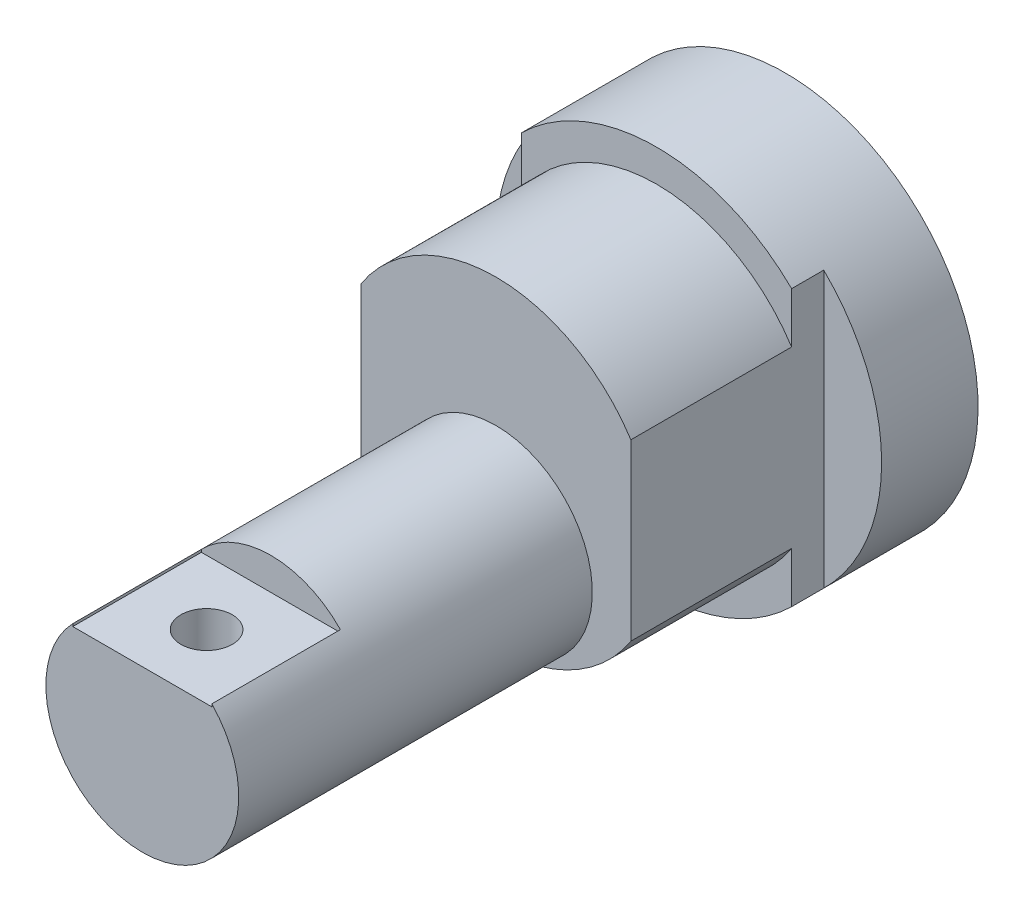
ISO-10303-21;
HEADER;
FILE_DESCRIPTION(('STEP AP214'),'2;1');
FILE_NAME('part.step','',(''),(''),'','','');
FILE_SCHEMA(('AUTOMOTIVE_DESIGN { 1 0 10303 214 1 1 1 1 }'));
ENDSEC;
DATA;
#1=APPLICATION_CONTEXT('core data for automotive mechanical design processes');
#2=APPLICATION_PROTOCOL_DEFINITION('international standard','automotive_design',2000,#1);
#3=PRODUCT_CONTEXT('',#1,'mechanical');
#4=PRODUCT('Part','Part','',(#3));
#5=PRODUCT_RELATED_PRODUCT_CATEGORY('part','',(#4));
#6=PRODUCT_DEFINITION_FORMATION('','',#4);
#7=PRODUCT_DEFINITION_CONTEXT('part definition',#1,'design');
#8=PRODUCT_DEFINITION('design','',#6,#7);
#9=PRODUCT_DEFINITION_SHAPE('','',#8);
#10=(LENGTH_UNIT() NAMED_UNIT(*) SI_UNIT(.MILLI.,.METRE.));
#11=(NAMED_UNIT(*) PLANE_ANGLE_UNIT() SI_UNIT($,.RADIAN.));
#12=(NAMED_UNIT(*) SI_UNIT($,.STERADIAN.) SOLID_ANGLE_UNIT());
#13=UNCERTAINTY_MEASURE_WITH_UNIT(LENGTH_MEASURE(1.E-05),#10,'distance_accuracy_value','');
#14=(GEOMETRIC_REPRESENTATION_CONTEXT(3) GLOBAL_UNCERTAINTY_ASSIGNED_CONTEXT((#13)) GLOBAL_UNIT_ASSIGNED_CONTEXT((#10,
#11,#12)) REPRESENTATION_CONTEXT('',''));
#15=CARTESIAN_POINT('',(0.,0.,0.));
#16=DIRECTION('',(0.,0.,1.));
#17=DIRECTION('',(1.,0.,0.));
#18=AXIS2_PLACEMENT_3D('',#15,#16,#17);
#19=CARTESIAN_POINT('',(0.,10.,-55.));
#20=DIRECTION('',(0.,0.,-1.));
#21=DIRECTION('',(-1.,0.,0.));
#22=AXIS2_PLACEMENT_3D('',#19,#20,#21);
#23=PLANE('',#22);
#24=DIRECTION('',(0.,-1.,0.));
#25=VECTOR('',#24,1.);
#26=CARTESIAN_POINT('',(-21.,25.,-55.));
#27=LINE('',#26,#25);
#28=CARTESIAN_POINT('',(-21.,23.5646599662505,-55.));
#29=VERTEX_POINT('',#28);
#30=CARTESIAN_POINT('',(-21.,-3.56465996625054,-55.));
#31=VERTEX_POINT('',#30);
#32=EDGE_CURVE('E142',#29,#31,#27,.T.);
#33=ORIENTED_EDGE('',*,*,#32,.T.);
#34=CARTESIAN_POINT('',(0.,10.,-55.));
#35=DIRECTION('',(0.,0.,-1.));
#36=DIRECTION('',(-1.,0.,0.));
#37=AXIS2_PLACEMENT_3D('',#34,#35,#36);
#38=CIRCLE('',#37,25.);
#39=CARTESIAN_POINT('',(0.,-15.,-55.));
#40=VERTEX_POINT('',#39);
#41=EDGE_CURVE('E166',#40,#31,#38,.T.);
#42=ORIENTED_EDGE('',*,*,#41,.F.);
#43=CARTESIAN_POINT('',(0.,0.,-55.));
#44=DIRECTION('',(0.,0.,1.));
#45=DIRECTION('',(1.,0.,0.));
#46=AXIS2_PLACEMENT_3D('',#43,#44,#45);
#47=CIRCLE('',#46,15.);
#48=EDGE_CURVE('E175',#40,#40,#47,.T.);
#49=ORIENTED_EDGE('',*,*,#48,.F.);
#50=CARTESIAN_POINT('',(21.,-3.56465996625054,-55.));
#51=VERTEX_POINT('',#50);
#52=EDGE_CURVE('E70',#51,#40,#38,.T.);
#53=ORIENTED_EDGE('',*,*,#52,.F.);
#54=DIRECTION('',(0.,-1.,0.));
#55=VECTOR('',#54,1.);
#56=CARTESIAN_POINT('',(21.,25.,-55.));
#57=LINE('',#56,#55);
#58=CARTESIAN_POINT('',(21.,23.5646599662505,-55.));
#59=VERTEX_POINT('',#58);
#60=EDGE_CURVE('E164',#59,#51,#57,.T.);
#61=ORIENTED_EDGE('',*,*,#60,.F.);
#62=EDGE_CURVE('E158',#29,#59,#38,.T.);
#63=ORIENTED_EDGE('',*,*,#62,.F.);
#64=EDGE_LOOP('',(#33,#42,#49,#53,#61,#63));
#65=FACE_BOUND('',#64,.T.);
#66=ADVANCED_FACE('F45',(#65),#23,.F.);
#67=CARTESIAN_POINT('',(0.,10.,-80.));
#68=DIRECTION('',(0.,0.,1.));
#69=DIRECTION('',(1.,0.,0.));
#70=AXIS2_PLACEMENT_3D('',#67,#68,#69);
#71=CYLINDRICAL_SURFACE('',#70,25.);
#72=DIRECTION('',(0.,0.,1.));
#73=VECTOR('',#72,1.);
#74=CARTESIAN_POINT('',(-21.,-3.56465996625054,-80.));
#75=LINE('',#74,#73);
#76=CARTESIAN_POINT('',(-21.,-3.56465996625054,-80.));
#77=VERTEX_POINT('',#76);
#78=EDGE_CURVE('E149',#77,#31,#75,.T.);
#79=ORIENTED_EDGE('',*,*,#78,.F.);
#80=CARTESIAN_POINT('',(0.,10.,-80.));
#81=DIRECTION('',(0.,0.,-1.));
#82=DIRECTION('',(-1.,0.,0.));
#83=AXIS2_PLACEMENT_3D('',#80,#81,#82);
#84=CIRCLE('',#83,25.);
#85=CARTESIAN_POINT('',(21.,-3.56465996625054,-80.));
#86=VERTEX_POINT('',#85);
#87=EDGE_CURVE('E173',#86,#77,#84,.T.);
#88=ORIENTED_EDGE('',*,*,#87,.F.);
#89=DIRECTION('',(0.,0.,1.));
#90=VECTOR('',#89,1.);
#91=CARTESIAN_POINT('',(21.,-3.56465996625054,-80.));
#92=LINE('',#91,#90);
#93=EDGE_CURVE('E233',#51,#86,#92,.F.);
#94=ORIENTED_EDGE('',*,*,#93,.F.);
#95=ORIENTED_EDGE('',*,*,#52,.T.);
#96=ORIENTED_EDGE('',*,*,#41,.T.);
#97=EDGE_LOOP('',(#79,#88,#94,#95,#96));
#98=FACE_BOUND('',#97,.T.);
#99=ADVANCED_FACE('F212',(#98),#71,.T.);
#100=DIRECTION('',(0.,0.,1.));
#101=VECTOR('',#100,1.);
#102=CARTESIAN_POINT('',(-21.,23.5646599662505,-80.));
#103=LINE('',#102,#101);
#104=CARTESIAN_POINT('',(-21.,23.5646599662505,-80.));
#105=VERTEX_POINT('',#104);
#106=EDGE_CURVE('E146',#29,#105,#103,.F.);
#107=ORIENTED_EDGE('',*,*,#106,.F.);
#108=ORIENTED_EDGE('',*,*,#62,.T.);
#109=DIRECTION('',(0.,0.,1.));
#110=VECTOR('',#109,1.);
#111=CARTESIAN_POINT('',(21.,23.5646599662505,-80.));
#112=LINE('',#111,#110);
#113=CARTESIAN_POINT('',(21.,23.5646599662505,-80.));
#114=VERTEX_POINT('',#113);
#115=EDGE_CURVE('E227',#114,#59,#112,.T.);
#116=ORIENTED_EDGE('',*,*,#115,.F.);
#117=EDGE_CURVE('E160',#105,#114,#84,.T.);
#118=ORIENTED_EDGE('',*,*,#117,.F.);
#119=EDGE_LOOP('',(#107,#108,#116,#118));
#120=FACE_BOUND('',#119,.T.);
#121=ADVANCED_FACE('F156',(#120),#71,.T.);
#122=CARTESIAN_POINT('',(0.,10.,-100.));
#123=DIRECTION('',(0.,0.,1.));
#124=DIRECTION('',(1.,0.,0.));
#125=AXIS2_PLACEMENT_3D('',#122,#123,#124);
#126=CYLINDRICAL_SURFACE('',#125,30.);
#127=CARTESIAN_POINT('',(0.,10.,-100.));
#128=DIRECTION('',(0.,0.,-1.));
#129=DIRECTION('',(-1.,0.,0.));
#130=AXIS2_PLACEMENT_3D('',#127,#128,#129);
#131=CIRCLE('',#130,30.);
#132=CARTESIAN_POINT('',(-30.,10.,-100.));
#133=VERTEX_POINT('',#132);
#134=EDGE_CURVE('E170',#133,#133,#131,.T.);
#135=ORIENTED_EDGE('',*,*,#134,.F.);
#136=EDGE_LOOP('',(#135));
#137=FACE_BOUND('',#136,.T.);
#138=DIRECTION('',(0.,0.,1.));
#139=VECTOR('',#138,1.);
#140=CARTESIAN_POINT('',(-21.,-11.4242852856286,-100.));
#141=LINE('',#140,#139);
#142=CARTESIAN_POINT('',(-21.,-11.4242852856286,-85.));
#143=VERTEX_POINT('',#142);
#144=CARTESIAN_POINT('',(-21.,-11.4242852856286,-80.));
#145=VERTEX_POINT('',#144);
#146=EDGE_CURVE('E206',#143,#145,#141,.T.);
#147=ORIENTED_EDGE('',*,*,#146,.F.);
#148=CARTESIAN_POINT('',(0.,10.,-85.));
#149=DIRECTION('',(0.,0.,-1.));
#150=DIRECTION('',(-1.,0.,0.));
#151=AXIS2_PLACEMENT_3D('',#148,#149,#150);
#152=CIRCLE('',#151,30.);
#153=CARTESIAN_POINT('',(-21.,31.4242852856285,-85.));
#154=VERTEX_POINT('',#153);
#155=EDGE_CURVE('E11',#143,#154,#152,.T.);
#156=ORIENTED_EDGE('',*,*,#155,.T.);
#157=DIRECTION('',(0.,0.,1.));
#158=VECTOR('',#157,1.);
#159=CARTESIAN_POINT('',(-21.,31.4242852856285,-100.));
#160=LINE('',#159,#158);
#161=CARTESIAN_POINT('',(-21.,31.4242852856285,-80.));
#162=VERTEX_POINT('',#161);
#163=EDGE_CURVE('E214',#162,#154,#160,.F.);
#164=ORIENTED_EDGE('',*,*,#163,.F.);
#165=CARTESIAN_POINT('',(0.,10.,-80.));
#166=DIRECTION('',(0.,0.,-1.));
#167=DIRECTION('',(-1.,0.,0.));
#168=AXIS2_PLACEMENT_3D('',#165,#166,#167);
#169=CIRCLE('',#168,30.);
#170=CARTESIAN_POINT('',(21.,31.4242852856285,-80.));
#171=VERTEX_POINT('',#170);
#172=EDGE_CURVE('E328',#162,#171,#169,.T.);
#173=ORIENTED_EDGE('',*,*,#172,.T.);
#174=DIRECTION('',(0.,0.,1.));
#175=VECTOR('',#174,1.);
#176=CARTESIAN_POINT('',(21.,31.4242852856285,-100.));
#177=LINE('',#176,#175);
#178=CARTESIAN_POINT('',(21.,31.4242852856285,-85.));
#179=VERTEX_POINT('',#178);
#180=EDGE_CURVE('E230',#179,#171,#177,.T.);
#181=ORIENTED_EDGE('',*,*,#180,.F.);
#182=CARTESIAN_POINT('',(0.,10.,-85.));
#183=DIRECTION('',(0.,0.,1.));
#184=DIRECTION('',(1.,0.,0.));
#185=AXIS2_PLACEMENT_3D('',#182,#183,#184);
#186=CIRCLE('',#185,30.);
#187=CARTESIAN_POINT('',(21.,-11.4242852856286,-85.));
#188=VERTEX_POINT('',#187);
#189=EDGE_CURVE('E198',#188,#179,#186,.T.);
#190=ORIENTED_EDGE('',*,*,#189,.F.);
#191=DIRECTION('',(0.,0.,1.));
#192=VECTOR('',#191,1.);
#193=CARTESIAN_POINT('',(21.,-11.4242852856286,-100.));
#194=LINE('',#193,#192);
#195=CARTESIAN_POINT('',(21.,-11.4242852856286,-80.));
#196=VERTEX_POINT('',#195);
#197=EDGE_CURVE('E232',#196,#188,#194,.F.);
#198=ORIENTED_EDGE('',*,*,#197,.F.);
#199=EDGE_CURVE('E331',#196,#145,#169,.T.);
#200=ORIENTED_EDGE('',*,*,#199,.T.);
#201=EDGE_LOOP('',(#147,#156,#164,#173,#181,#190,#198,#200));
#202=FACE_BOUND('',#201,.T.);
#203=ADVANCED_FACE('F289',(#137,#202),#126,.T.);
#204=CARTESIAN_POINT('',(0.,10.,-80.));
#205=DIRECTION('',(0.,0.,-1.));
#206=DIRECTION('',(-1.,0.,0.));
#207=AXIS2_PLACEMENT_3D('',#204,#205,#206);
#208=PLANE('',#207);
#209=DIRECTION('',(0.,1.,0.));
#210=VECTOR('',#209,1.);
#211=CARTESIAN_POINT('',(-21.,10.,-80.));
#212=LINE('',#211,#210);
#213=EDGE_CURVE('E55',#145,#77,#212,.T.);
#214=ORIENTED_EDGE('',*,*,#213,.F.);
#215=ORIENTED_EDGE('',*,*,#199,.F.);
#216=DIRECTION('',(0.,-1.,0.));
#217=VECTOR('',#216,1.);
#218=CARTESIAN_POINT('',(21.,10.,-80.));
#219=LINE('',#218,#217);
#220=EDGE_CURVE('E193',#86,#196,#219,.T.);
#221=ORIENTED_EDGE('',*,*,#220,.F.);
#222=ORIENTED_EDGE('',*,*,#87,.T.);
#223=EDGE_LOOP('',(#214,#215,#221,#222));
#224=FACE_BOUND('',#223,.T.);
#225=ADVANCED_FACE('F217',(#224),#208,.F.);
#226=EDGE_CURVE('E200',#105,#162,#212,.T.);
#227=ORIENTED_EDGE('',*,*,#226,.F.);
#228=ORIENTED_EDGE('',*,*,#117,.T.);
#229=EDGE_CURVE('E194',#171,#114,#219,.T.);
#230=ORIENTED_EDGE('',*,*,#229,.F.);
#231=ORIENTED_EDGE('',*,*,#172,.F.);
#232=EDGE_LOOP('',(#227,#228,#230,#231));
#233=FACE_BOUND('',#232,.T.);
#234=ADVANCED_FACE('F222',(#233),#208,.F.);
#235=CARTESIAN_POINT('',(0.,0.,-55.));
#236=DIRECTION('',(0.,0.,1.));
#237=DIRECTION('',(1.,0.,0.));
#238=AXIS2_PLACEMENT_3D('',#235,#236,#237);
#239=CYLINDRICAL_SURFACE('',#238,15.);
#240=CARTESIAN_POINT('',(0.,-15.,-6.));
#241=CARTESIAN_POINT('',(-0.220509111665708,-14.9999966762032,-6.0000052338697));
#242=CARTESIAN_POINT('',(-0.44107432044368,-14.995089723243,-6.01829522837934));
#243=CARTESIAN_POINT('',(-0.875850902708927,-14.9759914724332,-6.09084246147739));
#244=CARTESIAN_POINT('',(-1.09005916663817,-14.9617957066517,-6.14511700885223));
#245=CARTESIAN_POINT('',(-1.50578317809062,-14.9256866650558,-6.28774333372807));
#246=CARTESIAN_POINT('',(-1.70731490203057,-14.9037833426075,-6.37605117533204));
#247=CARTESIAN_POINT('',(-2.09270737278532,-14.8545739830336,-6.58407448533323));
#248=CARTESIAN_POINT('',(-2.27656694089925,-14.8272675859036,-6.70379204671858));
#249=CARTESIAN_POINT('',(-2.62565900748003,-14.7694922980399,-6.97416703282674));
#250=CARTESIAN_POINT('',(-2.79042337972557,-14.7389693535736,-7.12541733601653));
#251=CARTESIAN_POINT('',(-3.09257427321275,-14.6785481935918,-7.45329696612671));
#252=CARTESIAN_POINT('',(-3.22995726991329,-14.6486500589449,-7.62992955523505));
#253=CARTESIAN_POINT('',(-3.4757281848683,-14.5923107492874,-8.0072964696509));
#254=CARTESIAN_POINT('',(-3.58357755472975,-14.5659377712648,-8.20839265652346));
#255=CARTESIAN_POINT('',(-3.76375096153988,-14.5204295463637,-8.62668022218485));
#256=CARTESIAN_POINT('',(-3.83608154902738,-14.5012929650653,-8.84386862466287));
#257=CARTESIAN_POINT('',(-3.94153840453008,-14.472982316048,-9.28299107565003));
#258=CARTESIAN_POINT('',(-3.97551340489383,-14.4635929562298,-9.50470707986147));
#259=CARTESIAN_POINT('',(-4.00594069411639,-14.4551966183274,-9.95087536661308));
#260=CARTESIAN_POINT('',(-4.00239999411507,-14.4561877002889,-10.1753271300481));
#261=CARTESIAN_POINT('',(-3.95857020005398,-14.4682475760406,-10.6139708307481));
#262=CARTESIAN_POINT('',(-3.91930812129529,-14.4790347102306,-10.828274364077));
#263=CARTESIAN_POINT('',(-3.80679497444366,-14.5090202616138,-11.2471366689125));
#264=CARTESIAN_POINT('',(-3.7335411898599,-14.5282193510523,-11.4516946601507));
#265=CARTESIAN_POINT('',(-3.55428713930512,-14.5731132349677,-11.8479362876172));
#266=CARTESIAN_POINT('',(-3.44792682275569,-14.5988788563741,-12.0394486785725));
#267=CARTESIAN_POINT('',(-3.20573007647555,-14.6539645928489,-12.402268317703));
#268=CARTESIAN_POINT('',(-3.06988784448503,-14.6832854071037,-12.5735715783129));
#269=CARTESIAN_POINT('',(-2.76733214526838,-14.7433502125973,-12.8969779949096));
#270=CARTESIAN_POINT('',(-2.59975625456598,-14.7741094297766,-13.0482726366299));
#271=CARTESIAN_POINT('',(-2.24123533641275,-14.8327276255263,-13.3207775607006));
#272=CARTESIAN_POINT('',(-2.05028938841018,-14.8605864897711,-13.4419866574049));
#273=CARTESIAN_POINT('',(-1.6491965109949,-14.9104364079659,-13.6512358056493));
#274=CARTESIAN_POINT('',(-1.43896980510358,-14.9324014566712,-13.7391295408972));
#275=CARTESIAN_POINT('',(-1.00600458878079,-14.96780088802,-13.8780943776267));
#276=CARTESIAN_POINT('',(-0.783268823856647,-14.981237134675,-13.9291735254479));
#277=CARTESIAN_POINT('',(-0.33850816629103,-14.9977831711677,-13.9917897538357));
#278=CARTESIAN_POINT('',(-0.116648475282761,-15.0011799494192,-14.0044260797017));
#279=CARTESIAN_POINT('',(0.326020091802397,-14.9980894338339,-13.9928336715061));
#280=CARTESIAN_POINT('',(0.546829074124226,-14.9916031616071,-13.9686087477885));
#281=CARTESIAN_POINT('',(0.977204899803558,-14.9696607099204,-13.88488310508));
#282=CARTESIAN_POINT('',(1.18689970405556,-14.9543605309265,-13.8259955076045));
#283=CARTESIAN_POINT('',(1.59341394235213,-14.9165258978828,-13.6753281109841));
#284=CARTESIAN_POINT('',(1.79023197843205,-14.8939906599234,-13.5835447474989));
#285=CARTESIAN_POINT('',(2.1696769493359,-14.8435132111904,-13.3676522256389));
#286=CARTESIAN_POINT('',(2.35195037692236,-14.8154737320985,-13.2429450664045));
#287=CARTESIAN_POINT('',(2.69336927079429,-14.7572290473119,-12.965496739684));
#288=CARTESIAN_POINT('',(2.85251015759837,-14.7270234145527,-12.8127500347979));
#289=CARTESIAN_POINT('',(3.14777848957546,-14.6667949173317,-12.4784288450108));
#290=CARTESIAN_POINT('',(3.28313038499627,-14.6368012285772,-12.2961628772095));
#291=CARTESIAN_POINT('',(3.52134382370242,-14.5813289436636,-11.9108706078009));
#292=CARTESIAN_POINT('',(3.62420672244342,-14.5558501591602,-11.707845172756));
#293=CARTESIAN_POINT('',(3.79374823172205,-14.5125853674305,-11.2878093858471));
#294=CARTESIAN_POINT('',(3.8606362450784,-14.4947549662348,-11.0708883763624));
#295=CARTESIAN_POINT('',(3.95682410237657,-14.4687965026614,-10.6283213606529));
#296=CARTESIAN_POINT('',(3.98613355205236,-14.4606659608681,-10.4026775993132));
#297=CARTESIAN_POINT('',(4.00577979307212,-14.4552348910192,-9.9570104242114));
#298=CARTESIAN_POINT('',(3.99736311235129,-14.4575879532022,-9.73704535942668));
#299=CARTESIAN_POINT('',(3.94468751999858,-14.4720479199639,-9.3017929719295));
#300=CARTESIAN_POINT('',(3.9004295306998,-14.4841545735456,-9.08650552899045));
#301=CARTESIAN_POINT('',(3.77805031399794,-14.5165514219021,-8.66828849575977));
#302=CARTESIAN_POINT('',(3.70019322151266,-14.5367777005106,-8.46527631454085));
#303=CARTESIAN_POINT('',(3.51303109124666,-14.5831363626058,-8.0750423389265));
#304=CARTESIAN_POINT('',(3.40372112049204,-14.6092696723953,-7.8878230273976));
#305=CARTESIAN_POINT('',(3.15297818537663,-14.6654584288421,-7.52853928100823));
#306=CARTESIAN_POINT('',(3.01069459535827,-14.6956066620426,-7.35708293004796));
#307=CARTESIAN_POINT('',(2.69966107022192,-14.7559100756513,-7.04007509666496));
#308=CARTESIAN_POINT('',(2.53090470871747,-14.7860652559664,-6.89452992266221));
#309=CARTESIAN_POINT('',(2.16735996217739,-14.8437562480818,-6.63041552470639));
#310=CARTESIAN_POINT('',(1.97209192350356,-14.8712222262917,-6.51248997870137));
#311=CARTESIAN_POINT('',(1.56377728083377,-14.9196762020573,-6.31132516814125));
#312=CARTESIAN_POINT('',(1.35074218939259,-14.9406683536717,-6.22806364867279));
#313=CARTESIAN_POINT('',(0.948749409761982,-14.9710950502695,-6.10944942916897));
#314=CARTESIAN_POINT('',(0.761524033130071,-14.9818554118521,-6.06850123281501));
#315=CARTESIAN_POINT('',(0.382879590634151,-14.9963089807291,-6.01377558766588));
#316=CARTESIAN_POINT('',(0.19146094080972,-15.0000028859454,-5.99999545559995));
#317=CARTESIAN_POINT('',(0.,-15.,-6.));
#318=B_SPLINE_CURVE_WITH_KNOTS('',3,(#240,#241,#242,#243,#244,#245,#246,#247,#248,#249,#250,
#251,#252,#253,#254,#255,#256,#257,#258,#259,#260,#261,#262,#263,#264,#265,#266,#267,#268,#269,
#270,#271,#272,#273,#274,#275,#276,#277,#278,#279,#280,#281,#282,#283,#284,#285,#286,#287,#288,
#289,#290,#291,#292,#293,#294,#295,#296,#297,#298,#299,#300,#301,#302,#303,#304,#305,#306,#307,
#308,#309,#310,#311,#312,#313,#314,#315,#316,#317),.UNSPECIFIED.,.T.,.F.,(4,2,2,2,2,2,2,2,2,2,2,
2,2,2,2,2,2,2,2,2,2,2,2,2,2,2,2,2,2,2,2,2,2,2,2,2,2,2,4),(0.,0.660825197899137,1.3219684875229,
1.98226110594386,2.6425977341735,3.31669795909934,3.99088489850298,4.67665165046458,
5.36229188259399,6.03244316500935,6.70246920808639,7.35382004091993,8.00522293625879,
8.66397346692996,9.32285376235259,10.0032251962464,10.6836234387519,11.3669761920608,
12.0501795438028,12.7136543504909,13.377060578507,14.0290707128423,14.6811515155123,
15.346005720091,16.0109913651777,16.6947299276558,17.3784399604821,18.0581259539877,
18.7376381732797,19.394866848109,20.0520786104837,20.7042153090379,21.3564543425319,
22.0278867914997,22.6994824867208,23.3854450456898,24.0709665229755,24.6447963799386,
25.2185695593995),.UNSPECIFIED.);
#319=CARTESIAN_POINT('',(0.,-15.,-6.));
#320=VERTEX_POINT('',#319);
#321=EDGE_CURVE('E248',#320,#320,#318,.T.);
#322=ORIENTED_EDGE('',*,*,#321,.F.);
#323=EDGE_LOOP('',(#322));
#324=FACE_BOUND('',#323,.T.);
#325=ORIENTED_EDGE('',*,*,#48,.T.);
#326=EDGE_LOOP('',(#325));
#327=FACE_BOUND('',#326,.T.);
#328=CARTESIAN_POINT('',(0.,0.,0.));
#329=DIRECTION('',(0.,0.,1.));
#330=DIRECTION('',(1.,0.,0.));
#331=AXIS2_PLACEMENT_3D('',#328,#329,#330);
#332=CIRCLE('',#331,15.);
#333=CARTESIAN_POINT('',(-10.8113136380608,10.3978602327345,0.));
#334=VERTEX_POINT('',#333);
#335=CARTESIAN_POINT('',(10.8113136380608,10.3978602327345,0.));
#336=VERTEX_POINT('',#335);
#337=EDGE_CURVE('E180',#334,#336,#332,.T.);
#338=ORIENTED_EDGE('',*,*,#337,.F.);
#339=DIRECTION('',(0.,0.,1.));
#340=VECTOR('',#339,1.);
#341=CARTESIAN_POINT('',(-10.8113136380608,10.3978602327345,-55.));
#342=LINE('',#341,#340);
#343=CARTESIAN_POINT('',(-10.8113136380608,10.3978602327345,-20.));
#344=VERTEX_POINT('',#343);
#345=EDGE_CURVE('E324',#334,#344,#342,.F.);
#346=ORIENTED_EDGE('',*,*,#345,.T.);
#347=CARTESIAN_POINT('',(0.,0.,-20.));
#348=DIRECTION('',(0.,0.,-1.));
#349=DIRECTION('',(-1.,0.,0.));
#350=AXIS2_PLACEMENT_3D('',#347,#348,#349);
#351=CIRCLE('',#350,15.);
#352=CARTESIAN_POINT('',(10.8113136380607,10.3978602327345,-20.));
#353=VERTEX_POINT('',#352);
#354=EDGE_CURVE('E190',#353,#344,#351,.F.);
#355=ORIENTED_EDGE('',*,*,#354,.F.);
#356=DIRECTION('',(0.,0.,1.));
#357=VECTOR('',#356,1.);
#358=CARTESIAN_POINT('',(10.8113136380607,10.3978602327345,-55.));
#359=LINE('',#358,#357);
#360=EDGE_CURVE('E319',#336,#353,#359,.F.);
#361=ORIENTED_EDGE('',*,*,#360,.F.);
#362=EDGE_LOOP('',(#338,#346,#355,#361));
#363=FACE_BOUND('',#362,.T.);
#364=ADVANCED_FACE('F47',(#324,#327,#363),#239,.T.);
#365=CARTESIAN_POINT('',(0.,0.,0.));
#366=DIRECTION('',(0.,0.,1.));
#367=DIRECTION('',(1.,0.,0.));
#368=AXIS2_PLACEMENT_3D('',#365,#366,#367);
#369=PLANE('',#368);
#370=DIRECTION('',(1.,0.,0.));
#371=VECTOR('',#370,1.);
#372=CARTESIAN_POINT('',(-10.8113136380608,10.,0.));
#373=LINE('',#372,#371);
#374=CARTESIAN_POINT('',(-10.8113136380608,10.,0.));
#375=VERTEX_POINT('',#374);
#376=CARTESIAN_POINT('',(10.8113136380608,10.,0.));
#377=VERTEX_POINT('',#376);
#378=EDGE_CURVE('E304',#375,#377,#373,.T.);
#379=ORIENTED_EDGE('',*,*,#378,.F.);
#380=DIRECTION('',(0.,1.,0.));
#381=VECTOR('',#380,1.);
#382=CARTESIAN_POINT('',(-10.8113136380608,0.,0.));
#383=LINE('',#382,#381);
#384=EDGE_CURVE('E186',#375,#334,#383,.T.);
#385=ORIENTED_EDGE('',*,*,#384,.T.);
#386=ORIENTED_EDGE('',*,*,#337,.T.);
#387=DIRECTION('',(0.,1.,0.));
#388=VECTOR('',#387,1.);
#389=CARTESIAN_POINT('',(10.8113136380608,0.,0.));
#390=LINE('',#389,#388);
#391=EDGE_CURVE('E179',#377,#336,#390,.T.);
#392=ORIENTED_EDGE('',*,*,#391,.F.);
#393=EDGE_LOOP('',(#379,#385,#386,#392));
#394=FACE_BOUND('',#393,.T.);
#395=ADVANCED_FACE('F285',(#394),#369,.T.);
#396=CARTESIAN_POINT('',(0.,10.,-100.));
#397=DIRECTION('',(0.,0.,-1.));
#398=DIRECTION('',(-1.,0.,0.));
#399=AXIS2_PLACEMENT_3D('',#396,#397,#398);
#400=PLANE('',#399);
#401=ORIENTED_EDGE('',*,*,#134,.T.);
#402=EDGE_LOOP('',(#401));
#403=FACE_BOUND('',#402,.T.);
#404=ADVANCED_FACE('F281',(#403),#400,.T.);
#405=CARTESIAN_POINT('',(-10.8113136380608,30.,-20.));
#406=DIRECTION('',(0.,0.,-1.));
#407=DIRECTION('',(-1.,0.,0.));
#408=AXIS2_PLACEMENT_3D('',#405,#406,#407);
#409=PLANE('',#408);
#410=ORIENTED_EDGE('',*,*,#354,.T.);
#411=DIRECTION('',(0.,-1.,0.));
#412=VECTOR('',#411,1.);
#413=CARTESIAN_POINT('',(-10.8113136380608,30.,-20.));
#414=LINE('',#413,#412);
#415=CARTESIAN_POINT('',(-10.8113136380608,10.,-20.));
#416=VERTEX_POINT('',#415);
#417=EDGE_CURVE('E316',#344,#416,#414,.T.);
#418=ORIENTED_EDGE('',*,*,#417,.T.);
#419=DIRECTION('',(1.,0.,0.));
#420=VECTOR('',#419,1.);
#421=CARTESIAN_POINT('',(-10.8113136380608,10.,-20.));
#422=LINE('',#421,#420);
#423=CARTESIAN_POINT('',(10.8113136380607,10.,-20.));
#424=VERTEX_POINT('',#423);
#425=EDGE_CURVE('E256',#416,#424,#422,.T.);
#426=ORIENTED_EDGE('',*,*,#425,.T.);
#427=DIRECTION('',(0.,-1.,0.));
#428=VECTOR('',#427,1.);
#429=CARTESIAN_POINT('',(10.8113136380607,30.,-20.));
#430=LINE('',#429,#428);
#431=EDGE_CURVE('E313',#353,#424,#430,.T.);
#432=ORIENTED_EDGE('',*,*,#431,.F.);
#433=EDGE_LOOP('',(#410,#418,#426,#432));
#434=FACE_BOUND('',#433,.T.);
#435=ADVANCED_FACE('F274',(#434),#409,.F.);
#436=CARTESIAN_POINT('',(-10.8113136380608,30.,-20.));
#437=DIRECTION('',(1.,0.,0.));
#438=DIRECTION('',(0.,0.,-1.));
#439=AXIS2_PLACEMENT_3D('',#436,#437,#438);
#440=PLANE('',#439);
#441=ORIENTED_EDGE('',*,*,#384,.F.);
#442=DIRECTION('',(0.,0.,1.));
#443=VECTOR('',#442,1.);
#444=CARTESIAN_POINT('',(-10.8113136380608,10.,-20.));
#445=LINE('',#444,#443);
#446=EDGE_CURVE('E62',#416,#375,#445,.T.);
#447=ORIENTED_EDGE('',*,*,#446,.F.);
#448=ORIENTED_EDGE('',*,*,#417,.F.);
#449=ORIENTED_EDGE('',*,*,#345,.F.);
#450=EDGE_LOOP('',(#441,#447,#448,#449));
#451=FACE_BOUND('',#450,.T.);
#452=ADVANCED_FACE('F271',(#451),#440,.T.);
#453=CARTESIAN_POINT('',(10.8113136380607,30.,-20.));
#454=DIRECTION('',(1.,0.,0.));
#455=DIRECTION('',(0.,0.,-1.));
#456=AXIS2_PLACEMENT_3D('',#453,#454,#455);
#457=PLANE('',#456);
#458=ORIENTED_EDGE('',*,*,#360,.T.);
#459=ORIENTED_EDGE('',*,*,#431,.T.);
#460=DIRECTION('',(0.,0.,1.));
#461=VECTOR('',#460,1.);
#462=CARTESIAN_POINT('',(10.8113136380607,10.,-20.));
#463=LINE('',#462,#461);
#464=EDGE_CURVE('E309',#424,#377,#463,.T.);
#465=ORIENTED_EDGE('',*,*,#464,.T.);
#466=ORIENTED_EDGE('',*,*,#391,.T.);
#467=EDGE_LOOP('',(#458,#459,#465,#466));
#468=FACE_BOUND('',#467,.T.);
#469=ADVANCED_FACE('F269',(#468),#457,.F.);
#470=CARTESIAN_POINT('',(0.,10.,0.));
#471=DIRECTION('',(0.,-1.,0.));
#472=DIRECTION('',(0.,0.,-1.));
#473=AXIS2_PLACEMENT_3D('',#470,#471,#472);
#474=PLANE('',#473);
#475=CARTESIAN_POINT('',(0.,10.,-10.));
#476=DIRECTION('',(0.,1.,0.));
#477=DIRECTION('',(0.,0.,1.));
#478=AXIS2_PLACEMENT_3D('',#475,#476,#477);
#479=CIRCLE('',#478,4.);
#480=CARTESIAN_POINT('',(0.,10.,-6.));
#481=VERTEX_POINT('',#480);
#482=EDGE_CURVE('E244',#481,#481,#479,.T.);
#483=ORIENTED_EDGE('',*,*,#482,.F.);
#484=EDGE_LOOP('',(#483));
#485=FACE_BOUND('',#484,.T.);
#486=ORIENTED_EDGE('',*,*,#425,.F.);
#487=ORIENTED_EDGE('',*,*,#446,.T.);
#488=ORIENTED_EDGE('',*,*,#378,.T.);
#489=ORIENTED_EDGE('',*,*,#464,.F.);
#490=EDGE_LOOP('',(#486,#487,#488,#489));
#491=FACE_BOUND('',#490,.T.);
#492=ADVANCED_FACE('F264',(#485,#491),#474,.F.);
#493=CARTESIAN_POINT('',(0.,-20.,-10.));
#494=DIRECTION('',(0.,1.,0.));
#495=DIRECTION('',(0.,0.,1.));
#496=AXIS2_PLACEMENT_3D('',#493,#494,#495);
#497=CYLINDRICAL_SURFACE('',#496,4.);
#498=ORIENTED_EDGE('',*,*,#321,.T.);
#499=EDGE_LOOP('',(#498));
#500=FACE_BOUND('',#499,.T.);
#501=ORIENTED_EDGE('',*,*,#482,.T.);
#502=EDGE_LOOP('',(#501));
#503=FACE_BOUND('',#502,.T.);
#504=ADVANCED_FACE('F258',(#500,#503),#497,.F.);
#505=CARTESIAN_POINT('',(51.,-20.,-85.));
#506=DIRECTION('',(0.,0.,1.));
#507=DIRECTION('',(1.,0.,0.));
#508=AXIS2_PLACEMENT_3D('',#505,#506,#507);
#509=PLANE('',#508);
#510=ORIENTED_EDGE('',*,*,#189,.T.);
#511=DIRECTION('',(0.,1.,0.));
#512=VECTOR('',#511,1.);
#513=CARTESIAN_POINT('',(21.,-20.,-85.));
#514=LINE('',#513,#512);
#515=EDGE_CURVE('E238',#188,#179,#514,.T.);
#516=ORIENTED_EDGE('',*,*,#515,.F.);
#517=EDGE_LOOP('',(#510,#516));
#518=FACE_BOUND('',#517,.T.);
#519=ADVANCED_FACE('F263',(#518),#509,.T.);
#520=CARTESIAN_POINT('',(21.,0.,0.));
#521=DIRECTION('',(1.,0.,0.));
#522=DIRECTION('',(0.,0.,-1.));
#523=AXIS2_PLACEMENT_3D('',#520,#521,#522);
#524=PLANE('',#523);
#525=ORIENTED_EDGE('',*,*,#180,.T.);
#526=ORIENTED_EDGE('',*,*,#229,.T.);
#527=ORIENTED_EDGE('',*,*,#115,.T.);
#528=ORIENTED_EDGE('',*,*,#60,.T.);
#529=ORIENTED_EDGE('',*,*,#93,.T.);
#530=ORIENTED_EDGE('',*,*,#220,.T.);
#531=ORIENTED_EDGE('',*,*,#197,.T.);
#532=ORIENTED_EDGE('',*,*,#515,.T.);
#533=EDGE_LOOP('',(#525,#526,#527,#528,#529,#530,#531,#532));
#534=FACE_BOUND('',#533,.T.);
#535=ADVANCED_FACE('F226',(#534),#524,.T.);
#536=CARTESIAN_POINT('',(-51.,-20.,-85.));
#537=DIRECTION('',(0.,0.,-1.));
#538=DIRECTION('',(-1.,0.,0.));
#539=AXIS2_PLACEMENT_3D('',#536,#537,#538);
#540=PLANE('',#539);
#541=DIRECTION('',(0.,1.,0.));
#542=VECTOR('',#541,1.);
#543=CARTESIAN_POINT('',(-21.,-20.,-85.));
#544=LINE('',#543,#542);
#545=EDGE_CURVE('E153',#143,#154,#544,.T.);
#546=ORIENTED_EDGE('',*,*,#545,.T.);
#547=ORIENTED_EDGE('',*,*,#155,.F.);
#548=EDGE_LOOP('',(#546,#547));
#549=FACE_BOUND('',#548,.T.);
#550=ADVANCED_FACE('F351',(#549),#540,.F.);
#551=CARTESIAN_POINT('',(-21.,0.,0.));
#552=DIRECTION('',(-1.,0.,0.));
#553=DIRECTION('',(0.,0.,-1.));
#554=AXIS2_PLACEMENT_3D('',#551,#552,#553);
#555=PLANE('',#554);
#556=ORIENTED_EDGE('',*,*,#146,.T.);
#557=ORIENTED_EDGE('',*,*,#213,.T.);
#558=ORIENTED_EDGE('',*,*,#78,.T.);
#559=ORIENTED_EDGE('',*,*,#32,.F.);
#560=ORIENTED_EDGE('',*,*,#106,.T.);
#561=ORIENTED_EDGE('',*,*,#226,.T.);
#562=ORIENTED_EDGE('',*,*,#163,.T.);
#563=ORIENTED_EDGE('',*,*,#545,.F.);
#564=EDGE_LOOP('',(#556,#557,#558,#559,#560,#561,#562,#563));
#565=FACE_BOUND('',#564,.T.);
#566=ADVANCED_FACE('F145',(#565),#555,.T.);
#567=CLOSED_SHELL('',(#66,#99,#121,#203,#225,#234,#364,#395,#404,#435,#452,#469,#492,#504,#519,
#535,#550,#566));
#568=MANIFOLD_SOLID_BREP('B2',#567);
#569=ADVANCED_BREP_SHAPE_REPRESENTATION('',(#18,#568),#14);
#570=SHAPE_DEFINITION_REPRESENTATION(#9,#569);
ENDSEC;
END-ISO-10303-21;
